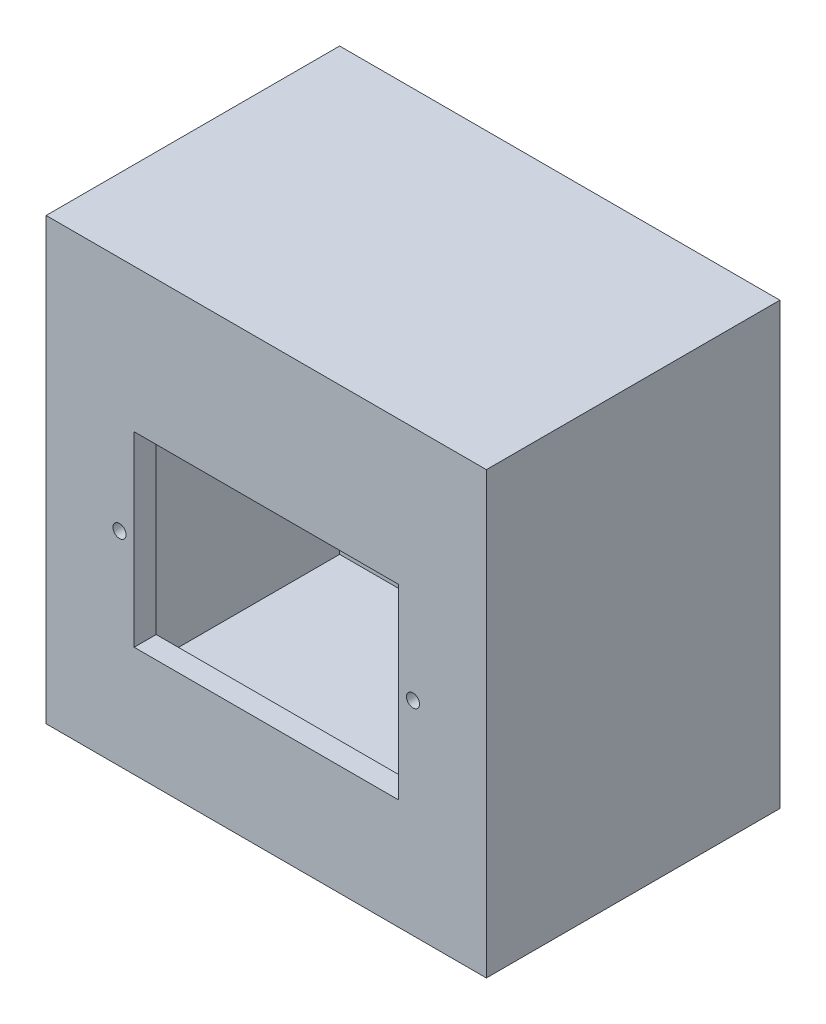
ISO-10303-21;
HEADER;
FILE_DESCRIPTION(('STEP AP214'),'2;1');
FILE_NAME('part.step','',(''),(''),'','','');
FILE_SCHEMA(('AUTOMOTIVE_DESIGN { 1 0 10303 214 1 1 1 1 }'));
ENDSEC;
DATA;
#1=APPLICATION_CONTEXT('core data for automotive mechanical design processes');
#2=APPLICATION_PROTOCOL_DEFINITION('international standard','automotive_design',2000,#1);
#3=PRODUCT_CONTEXT('',#1,'mechanical');
#4=PRODUCT('Part','Part','',(#3));
#5=PRODUCT_RELATED_PRODUCT_CATEGORY('part','',(#4));
#6=PRODUCT_DEFINITION_FORMATION('','',#4);
#7=PRODUCT_DEFINITION_CONTEXT('part definition',#1,'design');
#8=PRODUCT_DEFINITION('design','',#6,#7);
#9=PRODUCT_DEFINITION_SHAPE('','',#8);
#10=(LENGTH_UNIT() NAMED_UNIT(*) SI_UNIT(.MILLI.,.METRE.));
#11=(NAMED_UNIT(*) PLANE_ANGLE_UNIT() SI_UNIT($,.RADIAN.));
#12=(NAMED_UNIT(*) SI_UNIT($,.STERADIAN.) SOLID_ANGLE_UNIT());
#13=UNCERTAINTY_MEASURE_WITH_UNIT(LENGTH_MEASURE(1.E-05),#10,'distance_accuracy_value','');
#14=(GEOMETRIC_REPRESENTATION_CONTEXT(3) GLOBAL_UNCERTAINTY_ASSIGNED_CONTEXT((#13)) GLOBAL_UNIT_ASSIGNED_CONTEXT((#10,
#11,#12)) REPRESENTATION_CONTEXT('',''));
#15=CARTESIAN_POINT('',(0.,0.,0.));
#16=DIRECTION('',(0.,0.,1.));
#17=DIRECTION('',(1.,0.,0.));
#18=AXIS2_PLACEMENT_3D('',#15,#16,#17);
#19=CARTESIAN_POINT('',(-25.4,19.0956090691152,21.59));
#20=DIRECTION('',(-1.,0.,0.));
#21=DIRECTION('',(0.,-1.,0.));
#22=AXIS2_PLACEMENT_3D('',#19,#20,#21);
#23=PLANE('',#22);
#24=DIRECTION('',(0.,0.,1.));
#25=VECTOR('',#24,1.);
#26=CARTESIAN_POINT('',(-25.4,34.1197090691152,25.4));
#27=LINE('',#26,#25);
#28=CARTESIAN_POINT('',(-25.4,34.1197090691152,21.59));
#29=VERTEX_POINT('',#28);
#30=CARTESIAN_POINT('',(-25.4,34.1197090691152,22.86));
#31=VERTEX_POINT('',#30);
#32=EDGE_CURVE('E11',#29,#31,#27,.T.);
#33=ORIENTED_EDGE('',*,*,#32,.F.);
#34=DIRECTION('',(0.,-1.,0.));
#35=VECTOR('',#34,1.);
#36=CARTESIAN_POINT('',(-25.4,19.0956090691152,21.59));
#37=LINE('',#36,#35);
#38=CARTESIAN_POINT('',(-25.4,16.5556090691152,21.59));
#39=VERTEX_POINT('',#38);
#40=EDGE_CURVE('E185',#29,#39,#37,.T.);
#41=ORIENTED_EDGE('',*,*,#40,.T.);
#42=DIRECTION('',(0.,0.,1.));
#43=VECTOR('',#42,1.);
#44=CARTESIAN_POINT('',(-25.4,16.5556090691152,21.59));
#45=LINE('',#44,#43);
#46=CARTESIAN_POINT('',(-25.4,16.5556090691152,22.86));
#47=VERTEX_POINT('',#46);
#48=EDGE_CURVE('E306',#39,#47,#45,.T.);
#49=ORIENTED_EDGE('',*,*,#48,.T.);
#50=DIRECTION('',(0.,-1.,0.));
#51=VECTOR('',#50,1.);
#52=CARTESIAN_POINT('',(-25.4,19.0956090691152,22.86));
#53=LINE('',#52,#51);
#54=EDGE_CURVE('E293',#31,#47,#53,.T.);
#55=ORIENTED_EDGE('',*,*,#54,.F.);
#56=EDGE_LOOP('',(#33,#41,#49,#55));
#57=FACE_BOUND('',#56,.T.);
#58=ADVANCED_FACE('F33',(#57),#23,.T.);
#59=CARTESIAN_POINT('',(25.4,19.0956090691152,21.59));
#60=DIRECTION('',(1.,0.,0.));
#61=DIRECTION('',(0.,1.,0.));
#62=AXIS2_PLACEMENT_3D('',#59,#60,#61);
#63=PLANE('',#62);
#64=DIRECTION('',(0.,0.,1.));
#65=VECTOR('',#64,1.);
#66=CARTESIAN_POINT('',(25.4,36.3803090691153,25.4));
#67=LINE('',#66,#65);
#68=CARTESIAN_POINT('',(25.4,36.3803090691153,21.59));
#69=VERTEX_POINT('',#68);
#70=CARTESIAN_POINT('',(25.4,36.3803090691153,22.86));
#71=VERTEX_POINT('',#70);
#72=EDGE_CURVE('E175',#69,#71,#67,.T.);
#73=ORIENTED_EDGE('',*,*,#72,.F.);
#74=DIRECTION('',(0.,1.,0.));
#75=VECTOR('',#74,1.);
#76=CARTESIAN_POINT('',(25.4,19.0956090691152,21.59));
#77=LINE('',#76,#75);
#78=CARTESIAN_POINT('',(25.4,53.9444090691152,21.59));
#79=VERTEX_POINT('',#78);
#80=EDGE_CURVE('E290',#69,#79,#77,.T.);
#81=ORIENTED_EDGE('',*,*,#80,.T.);
#82=DIRECTION('',(0.,0.,1.));
#83=VECTOR('',#82,1.);
#84=CARTESIAN_POINT('',(25.4,53.9444090691152,21.59));
#85=LINE('',#84,#83);
#86=CARTESIAN_POINT('',(25.4,53.9444090691152,22.86));
#87=VERTEX_POINT('',#86);
#88=EDGE_CURVE('E193',#79,#87,#85,.T.);
#89=ORIENTED_EDGE('',*,*,#88,.T.);
#90=DIRECTION('',(0.,1.,0.));
#91=VECTOR('',#90,1.);
#92=CARTESIAN_POINT('',(25.4,19.0956090691152,22.86));
#93=LINE('',#92,#91);
#94=EDGE_CURVE('E273',#71,#87,#93,.T.);
#95=ORIENTED_EDGE('',*,*,#94,.F.);
#96=EDGE_LOOP('',(#73,#81,#89,#95));
#97=FACE_BOUND('',#96,.T.);
#98=ADVANCED_FACE('F279',(#97),#63,.T.);
#99=CARTESIAN_POINT('',(38.1,76.2,25.4));
#100=DIRECTION('',(-1.,0.,0.));
#101=DIRECTION('',(0.,0.,1.));
#102=AXIS2_PLACEMENT_3D('',#99,#100,#101);
#103=PLANE('',#102);
#104=DIRECTION('',(0.,0.,-1.));
#105=VECTOR('',#104,1.);
#106=CARTESIAN_POINT('',(38.1,0.,25.4));
#107=LINE('',#106,#105);
#108=CARTESIAN_POINT('',(38.1,0.,25.4));
#109=VERTEX_POINT('',#108);
#110=CARTESIAN_POINT('',(38.1,0.,-25.4));
#111=VERTEX_POINT('',#110);
#112=EDGE_CURVE('E222',#109,#111,#107,.T.);
#113=ORIENTED_EDGE('',*,*,#112,.T.);
#114=DIRECTION('',(0.,-1.,0.));
#115=VECTOR('',#114,1.);
#116=CARTESIAN_POINT('',(38.1,76.2,-25.4));
#117=LINE('',#116,#115);
#118=CARTESIAN_POINT('',(38.1,76.2,-25.4));
#119=VERTEX_POINT('',#118);
#120=EDGE_CURVE('E255',#119,#111,#117,.T.);
#121=ORIENTED_EDGE('',*,*,#120,.F.);
#122=DIRECTION('',(0.,0.,-1.));
#123=VECTOR('',#122,1.);
#124=CARTESIAN_POINT('',(38.1,76.2,25.4));
#125=LINE('',#124,#123);
#126=CARTESIAN_POINT('',(38.1,76.2,25.4));
#127=VERTEX_POINT('',#126);
#128=EDGE_CURVE('E229',#127,#119,#125,.T.);
#129=ORIENTED_EDGE('',*,*,#128,.F.);
#130=DIRECTION('',(0.,-1.,0.));
#131=VECTOR('',#130,1.);
#132=CARTESIAN_POINT('',(38.1,76.2,25.4));
#133=LINE('',#132,#131);
#134=EDGE_CURVE('E239',#127,#109,#133,.T.);
#135=ORIENTED_EDGE('',*,*,#134,.T.);
#136=EDGE_LOOP('',(#113,#121,#129,#135));
#137=FACE_BOUND('',#136,.T.);
#138=ADVANCED_FACE('F35',(#137),#103,.F.);
#139=CARTESIAN_POINT('',(-38.1,76.2,-25.4));
#140=DIRECTION('',(0.,0.,1.));
#141=DIRECTION('',(1.,0.,0.));
#142=AXIS2_PLACEMENT_3D('',#139,#140,#141);
#143=PLANE('',#142);
#144=CARTESIAN_POINT('',(-11.43,41.2535454474038,-25.4));
#145=DIRECTION('',(0.,0.,-1.));
#146=DIRECTION('',(0.,-1.,0.));
#147=AXIS2_PLACEMENT_3D('',#144,#145,#146);
#148=CIRCLE('',#147,2.794);
#149=CARTESIAN_POINT('',(-11.43,38.4595454474038,-25.4));
#150=VERTEX_POINT('',#149);
#151=EDGE_CURVE('E389',#150,#150,#148,.T.);
#152=ORIENTED_EDGE('',*,*,#151,.F.);
#153=EDGE_LOOP('',(#152));
#154=FACE_BOUND('',#153,.T.);
#155=CARTESIAN_POINT('',(-17.78,47.6035454474039,-25.4));
#156=DIRECTION('',(0.,0.,-1.));
#157=DIRECTION('',(1.,0.,0.));
#158=AXIS2_PLACEMENT_3D('',#155,#156,#157);
#159=CIRCLE('',#158,2.794);
#160=CARTESIAN_POINT('',(-14.986,47.6035454474039,-25.4));
#161=VERTEX_POINT('',#160);
#162=EDGE_CURVE('E393',#161,#161,#159,.T.);
#163=ORIENTED_EDGE('',*,*,#162,.F.);
#164=EDGE_LOOP('',(#163));
#165=FACE_BOUND('',#164,.T.);
#166=CARTESIAN_POINT('',(-24.13,41.2535454474039,-25.4));
#167=DIRECTION('',(0.,0.,-1.));
#168=DIRECTION('',(0.,1.,0.));
#169=AXIS2_PLACEMENT_3D('',#166,#167,#168);
#170=CIRCLE('',#169,2.794);
#171=CARTESIAN_POINT('',(-24.13,44.0475454474039,-25.4));
#172=VERTEX_POINT('',#171);
#173=EDGE_CURVE('E397',#172,#172,#170,.T.);
#174=ORIENTED_EDGE('',*,*,#173,.F.);
#175=EDGE_LOOP('',(#174));
#176=FACE_BOUND('',#175,.T.);
#177=CARTESIAN_POINT('',(-17.78,34.9035454474039,-25.4));
#178=DIRECTION('',(0.,0.,-1.));
#179=DIRECTION('',(-1.,0.,0.));
#180=AXIS2_PLACEMENT_3D('',#177,#178,#179);
#181=CIRCLE('',#180,2.794);
#182=CARTESIAN_POINT('',(-20.574,34.9035454474039,-25.4));
#183=VERTEX_POINT('',#182);
#184=EDGE_CURVE('E401',#183,#183,#181,.T.);
#185=ORIENTED_EDGE('',*,*,#184,.F.);
#186=EDGE_LOOP('',(#185));
#187=FACE_BOUND('',#186,.T.);
#188=CARTESIAN_POINT('',(24.13,41.2535454474038,-25.4));
#189=DIRECTION('',(0.,0.,-1.));
#190=DIRECTION('',(0.,-1.,0.));
#191=AXIS2_PLACEMENT_3D('',#188,#189,#190);
#192=CIRCLE('',#191,2.794);
#193=CARTESIAN_POINT('',(24.13,38.4595454474038,-25.4));
#194=VERTEX_POINT('',#193);
#195=EDGE_CURVE('E405',#194,#194,#192,.T.);
#196=ORIENTED_EDGE('',*,*,#195,.F.);
#197=EDGE_LOOP('',(#196));
#198=FACE_BOUND('',#197,.T.);
#199=CARTESIAN_POINT('',(17.78,47.6035454474039,-25.4));
#200=DIRECTION('',(0.,0.,-1.));
#201=DIRECTION('',(1.,0.,0.));
#202=AXIS2_PLACEMENT_3D('',#199,#200,#201);
#203=CIRCLE('',#202,2.794);
#204=CARTESIAN_POINT('',(20.574,47.6035454474039,-25.4));
#205=VERTEX_POINT('',#204);
#206=EDGE_CURVE('E409',#205,#205,#203,.T.);
#207=ORIENTED_EDGE('',*,*,#206,.F.);
#208=EDGE_LOOP('',(#207));
#209=FACE_BOUND('',#208,.T.);
#210=CARTESIAN_POINT('',(11.43,41.2535454474039,-25.4));
#211=DIRECTION('',(0.,0.,-1.));
#212=DIRECTION('',(0.,1.,0.));
#213=AXIS2_PLACEMENT_3D('',#210,#211,#212);
#214=CIRCLE('',#213,2.794);
#215=CARTESIAN_POINT('',(11.43,44.0475454474039,-25.4));
#216=VERTEX_POINT('',#215);
#217=EDGE_CURVE('E413',#216,#216,#214,.T.);
#218=ORIENTED_EDGE('',*,*,#217,.F.);
#219=EDGE_LOOP('',(#218));
#220=FACE_BOUND('',#219,.T.);
#221=CARTESIAN_POINT('',(17.78,34.9035454474039,-25.4));
#222=DIRECTION('',(0.,0.,-1.));
#223=DIRECTION('',(-1.,0.,0.));
#224=AXIS2_PLACEMENT_3D('',#221,#222,#223);
#225=CIRCLE('',#224,2.794);
#226=CARTESIAN_POINT('',(14.986,34.9035454474039,-25.4));
#227=VERTEX_POINT('',#226);
#228=EDGE_CURVE('E417',#227,#227,#225,.T.);
#229=ORIENTED_EDGE('',*,*,#228,.F.);
#230=EDGE_LOOP('',(#229));
#231=FACE_BOUND('',#230,.T.);
#232=DIRECTION('',(-1.,0.,0.));
#233=VECTOR('',#232,1.);
#234=CARTESIAN_POINT('',(-38.1,0.,-25.4));
#235=LINE('',#234,#233);
#236=CARTESIAN_POINT('',(-38.1,0.,-25.4));
#237=VERTEX_POINT('',#236);
#238=EDGE_CURVE('E242',#111,#237,#235,.T.);
#239=ORIENTED_EDGE('',*,*,#238,.T.);
#240=DIRECTION('',(0.,-1.,0.));
#241=VECTOR('',#240,1.);
#242=CARTESIAN_POINT('',(-38.1,76.2,-25.4));
#243=LINE('',#242,#241);
#244=CARTESIAN_POINT('',(-38.1,76.2,-25.4));
#245=VERTEX_POINT('',#244);
#246=EDGE_CURVE('E252',#245,#237,#243,.T.);
#247=ORIENTED_EDGE('',*,*,#246,.F.);
#248=DIRECTION('',(-1.,0.,0.));
#249=VECTOR('',#248,1.);
#250=CARTESIAN_POINT('',(-38.1,76.2,-25.4));
#251=LINE('',#250,#249);
#252=EDGE_CURVE('E232',#119,#245,#251,.T.);
#253=ORIENTED_EDGE('',*,*,#252,.F.);
#254=ORIENTED_EDGE('',*,*,#120,.T.);
#255=EDGE_LOOP('',(#239,#247,#253,#254));
#256=FACE_BOUND('',#255,.T.);
#257=ADVANCED_FACE('F378',(#154,#165,#176,#187,#198,#209,#220,#231,#256),#143,.F.);
#258=CARTESIAN_POINT('',(-38.1,76.2,25.4));
#259=DIRECTION('',(1.,0.,0.));
#260=DIRECTION('',(0.,0.,-1.));
#261=AXIS2_PLACEMENT_3D('',#258,#259,#260);
#262=PLANE('',#261);
#263=DIRECTION('',(0.,0.,1.));
#264=VECTOR('',#263,1.);
#265=CARTESIAN_POINT('',(-38.1,0.,25.4));
#266=LINE('',#265,#264);
#267=CARTESIAN_POINT('',(-38.1,0.,25.4));
#268=VERTEX_POINT('',#267);
#269=EDGE_CURVE('E244',#237,#268,#266,.T.);
#270=ORIENTED_EDGE('',*,*,#269,.T.);
#271=DIRECTION('',(0.,-1.,0.));
#272=VECTOR('',#271,1.);
#273=CARTESIAN_POINT('',(-38.1,76.2,25.4));
#274=LINE('',#273,#272);
#275=CARTESIAN_POINT('',(-38.1,76.2,25.4));
#276=VERTEX_POINT('',#275);
#277=EDGE_CURVE('E249',#276,#268,#274,.T.);
#278=ORIENTED_EDGE('',*,*,#277,.F.);
#279=DIRECTION('',(0.,0.,1.));
#280=VECTOR('',#279,1.);
#281=CARTESIAN_POINT('',(-38.1,76.2,25.4));
#282=LINE('',#281,#280);
#283=EDGE_CURVE('E235',#245,#276,#282,.T.);
#284=ORIENTED_EDGE('',*,*,#283,.F.);
#285=ORIENTED_EDGE('',*,*,#246,.T.);
#286=EDGE_LOOP('',(#270,#278,#284,#285));
#287=FACE_BOUND('',#286,.T.);
#288=ADVANCED_FACE('F375',(#287),#262,.F.);
#289=CARTESIAN_POINT('',(-38.1,76.2,25.4));
#290=DIRECTION('',(0.,0.,-1.));
#291=DIRECTION('',(-1.,0.,0.));
#292=AXIS2_PLACEMENT_3D('',#289,#290,#291);
#293=PLANE('',#292);
#294=CARTESIAN_POINT('',(-25.4,35.2500090691152,25.4));
#295=DIRECTION('',(0.,0.,1.));
#296=DIRECTION('',(1.,0.,0.));
#297=AXIS2_PLACEMENT_3D('',#294,#295,#296);
#298=CIRCLE('',#297,1.13029999999999);
#299=CARTESIAN_POINT('',(-24.2697,35.2500090691152,25.4));
#300=VERTEX_POINT('',#299);
#301=EDGE_CURVE('E430',#300,#300,#298,.T.);
#302=ORIENTED_EDGE('',*,*,#301,.F.);
#303=EDGE_LOOP('',(#302));
#304=FACE_BOUND('',#303,.T.);
#305=CARTESIAN_POINT('',(25.4,35.2500090691153,25.4));
#306=DIRECTION('',(0.,0.,1.));
#307=DIRECTION('',(1.,0.,0.));
#308=AXIS2_PLACEMENT_3D('',#305,#306,#307);
#309=CIRCLE('',#308,1.13029999999999);
#310=CARTESIAN_POINT('',(26.5303,35.2500090691153,25.4));
#311=VERTEX_POINT('',#310);
#312=EDGE_CURVE('E186',#311,#311,#309,.T.);
#313=ORIENTED_EDGE('',*,*,#312,.F.);
#314=EDGE_LOOP('',(#313));
#315=FACE_BOUND('',#314,.T.);
#316=DIRECTION('',(-1.,0.,0.));
#317=VECTOR('',#316,1.);
#318=CARTESIAN_POINT('',(-22.86,51.4044090691152,25.4));
#319=LINE('',#318,#317);
#320=CARTESIAN_POINT('',(22.86,51.4044090691152,25.4));
#321=VERTEX_POINT('',#320);
#322=CARTESIAN_POINT('',(-22.86,51.4044090691152,25.4));
#323=VERTEX_POINT('',#322);
#324=EDGE_CURVE('E211',#321,#323,#319,.T.);
#325=ORIENTED_EDGE('',*,*,#324,.F.);
#326=DIRECTION('',(0.,1.,0.));
#327=VECTOR('',#326,1.);
#328=CARTESIAN_POINT('',(22.86,19.0956090691152,25.4));
#329=LINE('',#328,#327);
#330=CARTESIAN_POINT('',(22.86,19.0956090691152,25.4));
#331=VERTEX_POINT('',#330);
#332=EDGE_CURVE('E209',#331,#321,#329,.T.);
#333=ORIENTED_EDGE('',*,*,#332,.F.);
#334=DIRECTION('',(1.,0.,0.));
#335=VECTOR('',#334,1.);
#336=CARTESIAN_POINT('',(-22.86,19.0956090691152,25.4));
#337=LINE('',#336,#335);
#338=CARTESIAN_POINT('',(-22.86,19.0956090691152,25.4));
#339=VERTEX_POINT('',#338);
#340=EDGE_CURVE('E202',#339,#331,#337,.T.);
#341=ORIENTED_EDGE('',*,*,#340,.F.);
#342=DIRECTION('',(0.,-1.,0.));
#343=VECTOR('',#342,1.);
#344=CARTESIAN_POINT('',(-22.86,19.0956090691152,25.4));
#345=LINE('',#344,#343);
#346=EDGE_CURVE('E215',#323,#339,#345,.T.);
#347=ORIENTED_EDGE('',*,*,#346,.F.);
#348=EDGE_LOOP('',(#325,#333,#341,#347));
#349=FACE_BOUND('',#348,.T.);
#350=DIRECTION('',(1.,0.,0.));
#351=VECTOR('',#350,1.);
#352=CARTESIAN_POINT('',(-38.1,0.,25.4));
#353=LINE('',#352,#351);
#354=EDGE_CURVE('E233',#268,#109,#353,.T.);
#355=ORIENTED_EDGE('',*,*,#354,.T.);
#356=ORIENTED_EDGE('',*,*,#134,.F.);
#357=DIRECTION('',(1.,0.,0.));
#358=VECTOR('',#357,1.);
#359=CARTESIAN_POINT('',(-38.1,76.2,25.4));
#360=LINE('',#359,#358);
#361=EDGE_CURVE('E237',#276,#127,#360,.T.);
#362=ORIENTED_EDGE('',*,*,#361,.F.);
#363=ORIENTED_EDGE('',*,*,#277,.T.);
#364=EDGE_LOOP('',(#355,#356,#362,#363));
#365=FACE_BOUND('',#364,.T.);
#366=ADVANCED_FACE('F368',(#304,#315,#349,#365),#293,.F.);
#367=CARTESIAN_POINT('',(0.,76.2,0.));
#368=DIRECTION('',(0.,-1.,0.));
#369=DIRECTION('',(0.,0.,-1.));
#370=AXIS2_PLACEMENT_3D('',#367,#368,#369);
#371=PLANE('',#370);
#372=ORIENTED_EDGE('',*,*,#128,.T.);
#373=ORIENTED_EDGE('',*,*,#252,.T.);
#374=ORIENTED_EDGE('',*,*,#283,.T.);
#375=ORIENTED_EDGE('',*,*,#361,.T.);
#376=EDGE_LOOP('',(#372,#373,#374,#375));
#377=FACE_BOUND('',#376,.T.);
#378=ADVANCED_FACE('F365',(#377),#371,.F.);
#379=CARTESIAN_POINT('',(0.,0.,0.));
#380=DIRECTION('',(0.,-1.,0.));
#381=DIRECTION('',(0.,0.,-1.));
#382=AXIS2_PLACEMENT_3D('',#379,#380,#381);
#383=PLANE('',#382);
#384=ORIENTED_EDGE('',*,*,#112,.F.);
#385=ORIENTED_EDGE('',*,*,#354,.F.);
#386=ORIENTED_EDGE('',*,*,#269,.F.);
#387=ORIENTED_EDGE('',*,*,#238,.F.);
#388=EDGE_LOOP('',(#384,#385,#386,#387));
#389=FACE_BOUND('',#388,.T.);
#390=ADVANCED_FACE('F363',(#389),#383,.T.);
#391=CARTESIAN_POINT('',(22.86,19.0956090691152,21.59));
#392=DIRECTION('',(1.,0.,0.));
#393=DIRECTION('',(0.,1.,0.));
#394=AXIS2_PLACEMENT_3D('',#391,#392,#393);
#395=PLANE('',#394);
#396=ORIENTED_EDGE('',*,*,#332,.T.);
#397=DIRECTION('',(0.,0.,1.));
#398=VECTOR('',#397,1.);
#399=CARTESIAN_POINT('',(22.86,51.4044090691152,21.59));
#400=LINE('',#399,#398);
#401=CARTESIAN_POINT('',(22.86,51.4044090691152,21.59));
#402=VERTEX_POINT('',#401);
#403=EDGE_CURVE('E208',#402,#321,#400,.T.);
#404=ORIENTED_EDGE('',*,*,#403,.F.);
#405=DIRECTION('',(0.,1.,0.));
#406=VECTOR('',#405,1.);
#407=CARTESIAN_POINT('',(22.86,19.0956090691152,21.59));
#408=LINE('',#407,#406);
#409=CARTESIAN_POINT('',(22.86,19.0956090691152,21.59));
#410=VERTEX_POINT('',#409);
#411=EDGE_CURVE('E199',#410,#402,#408,.T.);
#412=ORIENTED_EDGE('',*,*,#411,.F.);
#413=DIRECTION('',(0.,0.,1.));
#414=VECTOR('',#413,1.);
#415=CARTESIAN_POINT('',(22.86,19.0956090691152,21.59));
#416=LINE('',#415,#414);
#417=EDGE_CURVE('E220',#410,#331,#416,.T.);
#418=ORIENTED_EDGE('',*,*,#417,.T.);
#419=EDGE_LOOP('',(#396,#404,#412,#418));
#420=FACE_BOUND('',#419,.T.);
#421=ADVANCED_FACE('F352',(#420),#395,.F.);
#422=CARTESIAN_POINT('',(-22.86,19.0956090691152,21.59));
#423=DIRECTION('',(0.,-1.,0.));
#424=DIRECTION('',(0.,0.,-1.));
#425=AXIS2_PLACEMENT_3D('',#422,#423,#424);
#426=PLANE('',#425);
#427=ORIENTED_EDGE('',*,*,#340,.T.);
#428=ORIENTED_EDGE('',*,*,#417,.F.);
#429=DIRECTION('',(1.,0.,0.));
#430=VECTOR('',#429,1.);
#431=CARTESIAN_POINT('',(-22.86,19.0956090691152,21.59));
#432=LINE('',#431,#430);
#433=CARTESIAN_POINT('',(-22.86,19.0956090691152,21.59));
#434=VERTEX_POINT('',#433);
#435=EDGE_CURVE('E206',#434,#410,#432,.T.);
#436=ORIENTED_EDGE('',*,*,#435,.F.);
#437=DIRECTION('',(0.,0.,1.));
#438=VECTOR('',#437,1.);
#439=CARTESIAN_POINT('',(-22.86,19.0956090691152,21.59));
#440=LINE('',#439,#438);
#441=EDGE_CURVE('E223',#434,#339,#440,.T.);
#442=ORIENTED_EDGE('',*,*,#441,.T.);
#443=EDGE_LOOP('',(#427,#428,#436,#442));
#444=FACE_BOUND('',#443,.T.);
#445=ADVANCED_FACE('F348',(#444),#426,.F.);
#446=CARTESIAN_POINT('',(-22.86,19.0956090691152,21.59));
#447=DIRECTION('',(-1.,0.,0.));
#448=DIRECTION('',(0.,-1.,0.));
#449=AXIS2_PLACEMENT_3D('',#446,#447,#448);
#450=PLANE('',#449);
#451=ORIENTED_EDGE('',*,*,#346,.T.);
#452=ORIENTED_EDGE('',*,*,#441,.F.);
#453=DIRECTION('',(0.,-1.,0.));
#454=VECTOR('',#453,1.);
#455=CARTESIAN_POINT('',(-22.86,19.0956090691152,21.59));
#456=LINE('',#455,#454);
#457=CARTESIAN_POINT('',(-22.86,51.4044090691152,21.59));
#458=VERTEX_POINT('',#457);
#459=EDGE_CURVE('E204',#458,#434,#456,.T.);
#460=ORIENTED_EDGE('',*,*,#459,.F.);
#461=DIRECTION('',(0.,0.,1.));
#462=VECTOR('',#461,1.);
#463=CARTESIAN_POINT('',(-22.86,51.4044090691152,21.59));
#464=LINE('',#463,#462);
#465=EDGE_CURVE('E225',#458,#323,#464,.T.);
#466=ORIENTED_EDGE('',*,*,#465,.T.);
#467=EDGE_LOOP('',(#451,#452,#460,#466));
#468=FACE_BOUND('',#467,.T.);
#469=ADVANCED_FACE('F351',(#468),#450,.F.);
#470=CARTESIAN_POINT('',(-22.86,51.4044090691152,21.59));
#471=DIRECTION('',(0.,1.,0.));
#472=DIRECTION('',(0.,0.,1.));
#473=AXIS2_PLACEMENT_3D('',#470,#471,#472);
#474=PLANE('',#473);
#475=ORIENTED_EDGE('',*,*,#324,.T.);
#476=ORIENTED_EDGE('',*,*,#465,.F.);
#477=DIRECTION('',(-1.,0.,0.));
#478=VECTOR('',#477,1.);
#479=CARTESIAN_POINT('',(-22.86,51.4044090691152,21.59));
#480=LINE('',#479,#478);
#481=EDGE_CURVE('E201',#402,#458,#480,.T.);
#482=ORIENTED_EDGE('',*,*,#481,.F.);
#483=ORIENTED_EDGE('',*,*,#403,.T.);
#484=EDGE_LOOP('',(#475,#476,#482,#483));
#485=FACE_BOUND('',#484,.T.);
#486=ADVANCED_FACE('F356',(#485),#474,.F.);
#487=CARTESIAN_POINT('',(0.,0.,21.59));
#488=DIRECTION('',(0.,0.,-1.));
#489=DIRECTION('',(-1.,0.,0.));
#490=AXIS2_PLACEMENT_3D('',#487,#488,#489);
#491=PLANE('',#490);
#492=CARTESIAN_POINT('',(-25.4,35.2500090691152,21.59));
#493=DIRECTION('',(0.,0.,-1.));
#494=DIRECTION('',(-1.,0.,0.));
#495=AXIS2_PLACEMENT_3D('',#492,#493,#494);
#496=CIRCLE('',#495,1.13029999999999);
#497=CARTESIAN_POINT('',(-25.4,36.3803090691152,21.59));
#498=VERTEX_POINT('',#497);
#499=EDGE_CURVE('E169',#498,#29,#496,.T.);
#500=ORIENTED_EDGE('',*,*,#499,.F.);
#501=CARTESIAN_POINT('',(-25.4,53.9444090691152,21.59));
#502=VERTEX_POINT('',#501);
#503=EDGE_CURVE('E182',#502,#498,#37,.T.);
#504=ORIENTED_EDGE('',*,*,#503,.F.);
#505=DIRECTION('',(-1.,0.,0.));
#506=VECTOR('',#505,1.);
#507=CARTESIAN_POINT('',(-22.86,53.9444090691152,21.59));
#508=LINE('',#507,#506);
#509=EDGE_CURVE('E195',#79,#502,#508,.T.);
#510=ORIENTED_EDGE('',*,*,#509,.F.);
#511=ORIENTED_EDGE('',*,*,#80,.F.);
#512=CARTESIAN_POINT('',(25.4,35.2500090691153,21.59));
#513=DIRECTION('',(0.,0.,-1.));
#514=DIRECTION('',(-1.,0.,0.));
#515=AXIS2_PLACEMENT_3D('',#512,#513,#514);
#516=CIRCLE('',#515,1.13029999999999);
#517=CARTESIAN_POINT('',(25.4,34.1197090691153,21.59));
#518=VERTEX_POINT('',#517);
#519=EDGE_CURVE('E264',#518,#69,#516,.T.);
#520=ORIENTED_EDGE('',*,*,#519,.F.);
#521=CARTESIAN_POINT('',(25.4,16.5556090691152,21.59));
#522=VERTEX_POINT('',#521);
#523=EDGE_CURVE('E309',#522,#518,#77,.T.);
#524=ORIENTED_EDGE('',*,*,#523,.F.);
#525=DIRECTION('',(1.,0.,0.));
#526=VECTOR('',#525,1.);
#527=CARTESIAN_POINT('',(-22.86,16.5556090691152,21.59));
#528=LINE('',#527,#526);
#529=EDGE_CURVE('E190',#39,#522,#528,.T.);
#530=ORIENTED_EDGE('',*,*,#529,.F.);
#531=ORIENTED_EDGE('',*,*,#40,.F.);
#532=EDGE_LOOP('',(#500,#504,#510,#511,#520,#524,#530,#531));
#533=FACE_BOUND('',#532,.T.);
#534=ORIENTED_EDGE('',*,*,#411,.T.);
#535=ORIENTED_EDGE('',*,*,#481,.T.);
#536=ORIENTED_EDGE('',*,*,#459,.T.);
#537=ORIENTED_EDGE('',*,*,#435,.T.);
#538=EDGE_LOOP('',(#534,#535,#536,#537));
#539=FACE_BOUND('',#538,.T.);
#540=ADVANCED_FACE('F179',(#533,#539),#491,.T.);
#541=CARTESIAN_POINT('',(35.56,76.2,25.4));
#542=DIRECTION('',(-1.,0.,0.));
#543=DIRECTION('',(0.,0.,1.));
#544=AXIS2_PLACEMENT_3D('',#541,#542,#543);
#545=PLANE('',#544);
#546=DIRECTION('',(0.,0.,-1.));
#547=VECTOR('',#546,1.);
#548=CARTESIAN_POINT('',(35.56,2.54,0.));
#549=LINE('',#548,#547);
#550=CARTESIAN_POINT('',(35.56,2.54,22.86));
#551=VERTEX_POINT('',#550);
#552=CARTESIAN_POINT('',(35.56,2.54,-22.86));
#553=VERTEX_POINT('',#552);
#554=EDGE_CURVE('E305',#551,#553,#549,.T.);
#555=ORIENTED_EDGE('',*,*,#554,.F.);
#556=DIRECTION('',(0.,-1.,0.));
#557=VECTOR('',#556,1.);
#558=CARTESIAN_POINT('',(35.56,76.2,22.86));
#559=LINE('',#558,#557);
#560=CARTESIAN_POINT('',(35.56,73.66,22.86));
#561=VERTEX_POINT('',#560);
#562=EDGE_CURVE('E300',#561,#551,#559,.T.);
#563=ORIENTED_EDGE('',*,*,#562,.F.);
#564=DIRECTION('',(0.,0.,-1.));
#565=VECTOR('',#564,1.);
#566=CARTESIAN_POINT('',(35.56,73.66,0.));
#567=LINE('',#566,#565);
#568=CARTESIAN_POINT('',(35.56,73.66,-22.86));
#569=VERTEX_POINT('',#568);
#570=EDGE_CURVE('E296',#561,#569,#567,.T.);
#571=ORIENTED_EDGE('',*,*,#570,.T.);
#572=DIRECTION('',(0.,-1.,0.));
#573=VECTOR('',#572,1.);
#574=CARTESIAN_POINT('',(35.56,76.2,-22.86));
#575=LINE('',#574,#573);
#576=EDGE_CURVE('E212',#569,#553,#575,.T.);
#577=ORIENTED_EDGE('',*,*,#576,.T.);
#578=EDGE_LOOP('',(#555,#563,#571,#577));
#579=FACE_BOUND('',#578,.T.);
#580=ADVANCED_FACE('F476',(#579),#545,.T.);
#581=CARTESIAN_POINT('',(-38.1,76.2,-22.86));
#582=DIRECTION('',(0.,0.,1.));
#583=DIRECTION('',(1.,0.,0.));
#584=AXIS2_PLACEMENT_3D('',#581,#582,#583);
#585=PLANE('',#584);
#586=CARTESIAN_POINT('',(-11.43,41.2535454474038,-22.86));
#587=DIRECTION('',(0.,0.,1.));
#588=DIRECTION('',(1.,0.,0.));
#589=AXIS2_PLACEMENT_3D('',#586,#587,#588);
#590=CIRCLE('',#589,2.794);
#591=CARTESIAN_POINT('',(-8.63599999999999,41.2535454474038,-22.86));
#592=VERTEX_POINT('',#591);
#593=EDGE_CURVE('E663',#592,#592,#590,.F.);
#594=ORIENTED_EDGE('',*,*,#593,.T.);
#595=EDGE_LOOP('',(#594));
#596=FACE_BOUND('',#595,.T.);
#597=CARTESIAN_POINT('',(-17.78,47.6035454474039,-22.86));
#598=DIRECTION('',(0.,0.,1.));
#599=DIRECTION('',(1.,0.,0.));
#600=AXIS2_PLACEMENT_3D('',#597,#598,#599);
#601=CIRCLE('',#600,2.794);
#602=CARTESIAN_POINT('',(-14.986,47.6035454474039,-22.86));
#603=VERTEX_POINT('',#602);
#604=EDGE_CURVE('E664',#603,#603,#601,.F.);
#605=ORIENTED_EDGE('',*,*,#604,.T.);
#606=EDGE_LOOP('',(#605));
#607=FACE_BOUND('',#606,.T.);
#608=CARTESIAN_POINT('',(-24.13,41.2535454474039,-22.86));
#609=DIRECTION('',(0.,0.,1.));
#610=DIRECTION('',(1.,0.,0.));
#611=AXIS2_PLACEMENT_3D('',#608,#609,#610);
#612=CIRCLE('',#611,2.794);
#613=CARTESIAN_POINT('',(-21.336,41.2535454474039,-22.86));
#614=VERTEX_POINT('',#613);
#615=EDGE_CURVE('E670',#614,#614,#612,.F.);
#616=ORIENTED_EDGE('',*,*,#615,.T.);
#617=EDGE_LOOP('',(#616));
#618=FACE_BOUND('',#617,.T.);
#619=CARTESIAN_POINT('',(-17.78,34.9035454474039,-22.86));
#620=DIRECTION('',(0.,0.,1.));
#621=DIRECTION('',(1.,0.,0.));
#622=AXIS2_PLACEMENT_3D('',#619,#620,#621);
#623=CIRCLE('',#622,2.794);
#624=CARTESIAN_POINT('',(-14.986,34.9035454474039,-22.86));
#625=VERTEX_POINT('',#624);
#626=EDGE_CURVE('E675',#625,#625,#623,.F.);
#627=ORIENTED_EDGE('',*,*,#626,.T.);
#628=EDGE_LOOP('',(#627));
#629=FACE_BOUND('',#628,.T.);
#630=CARTESIAN_POINT('',(24.13,41.2535454474038,-22.86));
#631=DIRECTION('',(0.,0.,1.));
#632=DIRECTION('',(1.,0.,0.));
#633=AXIS2_PLACEMENT_3D('',#630,#631,#632);
#634=CIRCLE('',#633,2.794);
#635=CARTESIAN_POINT('',(26.924,41.2535454474038,-22.86));
#636=VERTEX_POINT('',#635);
#637=EDGE_CURVE('E677',#636,#636,#634,.F.);
#638=ORIENTED_EDGE('',*,*,#637,.T.);
#639=EDGE_LOOP('',(#638));
#640=FACE_BOUND('',#639,.T.);
#641=CARTESIAN_POINT('',(17.78,47.6035454474039,-22.86));
#642=DIRECTION('',(0.,0.,1.));
#643=DIRECTION('',(1.,0.,0.));
#644=AXIS2_PLACEMENT_3D('',#641,#642,#643);
#645=CIRCLE('',#644,2.794);
#646=CARTESIAN_POINT('',(20.574,47.6035454474039,-22.86));
#647=VERTEX_POINT('',#646);
#648=EDGE_CURVE('E683',#647,#647,#645,.F.);
#649=ORIENTED_EDGE('',*,*,#648,.T.);
#650=EDGE_LOOP('',(#649));
#651=FACE_BOUND('',#650,.T.);
#652=CARTESIAN_POINT('',(11.43,41.2535454474039,-22.86));
#653=DIRECTION('',(0.,0.,1.));
#654=DIRECTION('',(1.,0.,0.));
#655=AXIS2_PLACEMENT_3D('',#652,#653,#654);
#656=CIRCLE('',#655,2.794);
#657=CARTESIAN_POINT('',(14.224,41.2535454474039,-22.86));
#658=VERTEX_POINT('',#657);
#659=EDGE_CURVE('E438',#658,#658,#656,.F.);
#660=ORIENTED_EDGE('',*,*,#659,.T.);
#661=EDGE_LOOP('',(#660));
#662=FACE_BOUND('',#661,.T.);
#663=CARTESIAN_POINT('',(17.78,34.9035454474039,-22.86));
#664=DIRECTION('',(0.,0.,1.));
#665=DIRECTION('',(1.,0.,0.));
#666=AXIS2_PLACEMENT_3D('',#663,#664,#665);
#667=CIRCLE('',#666,2.794);
#668=CARTESIAN_POINT('',(20.574,34.9035454474039,-22.86));
#669=VERTEX_POINT('',#668);
#670=EDGE_CURVE('E431',#669,#669,#667,.F.);
#671=ORIENTED_EDGE('',*,*,#670,.T.);
#672=EDGE_LOOP('',(#671));
#673=FACE_BOUND('',#672,.T.);
#674=DIRECTION('',(-1.,0.,0.));
#675=VECTOR('',#674,1.);
#676=CARTESIAN_POINT('',(0.,2.54,-22.86));
#677=LINE('',#676,#675);
#678=CARTESIAN_POINT('',(-35.56,2.54,-22.86));
#679=VERTEX_POINT('',#678);
#680=EDGE_CURVE('E446',#553,#679,#677,.T.);
#681=ORIENTED_EDGE('',*,*,#680,.F.);
#682=ORIENTED_EDGE('',*,*,#576,.F.);
#683=DIRECTION('',(-1.,0.,0.));
#684=VECTOR('',#683,1.);
#685=CARTESIAN_POINT('',(0.,73.66,-22.86));
#686=LINE('',#685,#684);
#687=CARTESIAN_POINT('',(-35.56,73.66,-22.86));
#688=VERTEX_POINT('',#687);
#689=EDGE_CURVE('E452',#569,#688,#686,.T.);
#690=ORIENTED_EDGE('',*,*,#689,.T.);
#691=DIRECTION('',(0.,-1.,0.));
#692=VECTOR('',#691,1.);
#693=CARTESIAN_POINT('',(-35.56,76.2,-22.86));
#694=LINE('',#693,#692);
#695=EDGE_CURVE('E449',#688,#679,#694,.T.);
#696=ORIENTED_EDGE('',*,*,#695,.T.);
#697=EDGE_LOOP('',(#681,#682,#690,#696));
#698=FACE_BOUND('',#697,.T.);
#699=ADVANCED_FACE('F478',(#596,#607,#618,#629,#640,#651,#662,#673,#698),#585,.T.);
#700=CARTESIAN_POINT('',(-35.56,76.2,25.4));
#701=DIRECTION('',(1.,0.,0.));
#702=DIRECTION('',(0.,0.,-1.));
#703=AXIS2_PLACEMENT_3D('',#700,#701,#702);
#704=PLANE('',#703);
#705=DIRECTION('',(0.,0.,1.));
#706=VECTOR('',#705,1.);
#707=CARTESIAN_POINT('',(-35.56,2.54,0.));
#708=LINE('',#707,#706);
#709=CARTESIAN_POINT('',(-35.56,2.54,22.86));
#710=VERTEX_POINT('',#709);
#711=EDGE_CURVE('E297',#679,#710,#708,.T.);
#712=ORIENTED_EDGE('',*,*,#711,.F.);
#713=ORIENTED_EDGE('',*,*,#695,.F.);
#714=DIRECTION('',(0.,0.,1.));
#715=VECTOR('',#714,1.);
#716=CARTESIAN_POINT('',(-35.56,73.66,0.));
#717=LINE('',#716,#715);
#718=CARTESIAN_POINT('',(-35.56,73.66,22.86));
#719=VERTEX_POINT('',#718);
#720=EDGE_CURVE('E301',#688,#719,#717,.T.);
#721=ORIENTED_EDGE('',*,*,#720,.T.);
#722=DIRECTION('',(0.,-1.,0.));
#723=VECTOR('',#722,1.);
#724=CARTESIAN_POINT('',(-35.56,76.2,22.86));
#725=LINE('',#724,#723);
#726=EDGE_CURVE('E455',#719,#710,#725,.T.);
#727=ORIENTED_EDGE('',*,*,#726,.T.);
#728=EDGE_LOOP('',(#712,#713,#721,#727));
#729=FACE_BOUND('',#728,.T.);
#730=ADVANCED_FACE('F467',(#729),#704,.T.);
#731=CARTESIAN_POINT('',(-38.1,76.2,22.86));
#732=DIRECTION('',(0.,0.,-1.));
#733=DIRECTION('',(-1.,0.,0.));
#734=AXIS2_PLACEMENT_3D('',#731,#732,#733);
#735=PLANE('',#734);
#736=CARTESIAN_POINT('',(-25.4,35.2500090691152,22.86));
#737=DIRECTION('',(0.,0.,-1.));
#738=DIRECTION('',(-1.,0.,0.));
#739=AXIS2_PLACEMENT_3D('',#736,#737,#738);
#740=CIRCLE('',#739,1.13029999999999);
#741=CARTESIAN_POINT('',(-25.4,36.3803090691152,22.86));
#742=VERTEX_POINT('',#741);
#743=EDGE_CURVE('E47',#31,#742,#740,.T.);
#744=ORIENTED_EDGE('',*,*,#743,.F.);
#745=ORIENTED_EDGE('',*,*,#54,.T.);
#746=DIRECTION('',(1.,0.,0.));
#747=VECTOR('',#746,1.);
#748=CARTESIAN_POINT('',(-22.86,16.5556090691152,22.86));
#749=LINE('',#748,#747);
#750=CARTESIAN_POINT('',(25.4,16.5556090691152,22.86));
#751=VERTEX_POINT('',#750);
#752=EDGE_CURVE('E288',#47,#751,#749,.T.);
#753=ORIENTED_EDGE('',*,*,#752,.T.);
#754=CARTESIAN_POINT('',(25.4,34.1197090691153,22.86));
#755=VERTEX_POINT('',#754);
#756=EDGE_CURVE('E277',#751,#755,#93,.T.);
#757=ORIENTED_EDGE('',*,*,#756,.T.);
#758=CARTESIAN_POINT('',(25.4,35.2500090691153,22.86));
#759=DIRECTION('',(0.,0.,-1.));
#760=DIRECTION('',(-1.,0.,0.));
#761=AXIS2_PLACEMENT_3D('',#758,#759,#760);
#762=CIRCLE('',#761,1.13029999999999);
#763=EDGE_CURVE('E55',#71,#755,#762,.T.);
#764=ORIENTED_EDGE('',*,*,#763,.F.);
#765=ORIENTED_EDGE('',*,*,#94,.T.);
#766=DIRECTION('',(-1.,0.,0.));
#767=VECTOR('',#766,1.);
#768=CARTESIAN_POINT('',(-22.86,53.9444090691152,22.86));
#769=LINE('',#768,#767);
#770=CARTESIAN_POINT('',(-25.4,53.9444090691152,22.86));
#771=VERTEX_POINT('',#770);
#772=EDGE_CURVE('E283',#87,#771,#769,.T.);
#773=ORIENTED_EDGE('',*,*,#772,.T.);
#774=EDGE_CURVE('E291',#771,#742,#53,.T.);
#775=ORIENTED_EDGE('',*,*,#774,.T.);
#776=EDGE_LOOP('',(#744,#745,#753,#757,#764,#765,#773,#775));
#777=FACE_BOUND('',#776,.T.);
#778=DIRECTION('',(1.,0.,0.));
#779=VECTOR('',#778,1.);
#780=CARTESIAN_POINT('',(0.,2.54,22.86));
#781=LINE('',#780,#779);
#782=EDGE_CURVE('E294',#710,#551,#781,.T.);
#783=ORIENTED_EDGE('',*,*,#782,.F.);
#784=ORIENTED_EDGE('',*,*,#726,.F.);
#785=DIRECTION('',(1.,0.,0.));
#786=VECTOR('',#785,1.);
#787=CARTESIAN_POINT('',(0.,73.66,22.86));
#788=LINE('',#787,#786);
#789=EDGE_CURVE('E298',#719,#561,#788,.T.);
#790=ORIENTED_EDGE('',*,*,#789,.T.);
#791=ORIENTED_EDGE('',*,*,#562,.T.);
#792=EDGE_LOOP('',(#783,#784,#790,#791));
#793=FACE_BOUND('',#792,.T.);
#794=ADVANCED_FACE('F270',(#777,#793),#735,.T.);
#795=CARTESIAN_POINT('',(0.,73.66,0.));
#796=DIRECTION('',(0.,-1.,0.));
#797=DIRECTION('',(0.,0.,-1.));
#798=AXIS2_PLACEMENT_3D('',#795,#796,#797);
#799=PLANE('',#798);
#800=ORIENTED_EDGE('',*,*,#570,.F.);
#801=ORIENTED_EDGE('',*,*,#789,.F.);
#802=ORIENTED_EDGE('',*,*,#720,.F.);
#803=ORIENTED_EDGE('',*,*,#689,.F.);
#804=EDGE_LOOP('',(#800,#801,#802,#803));
#805=FACE_BOUND('',#804,.T.);
#806=ADVANCED_FACE('F330',(#805),#799,.T.);
#807=CARTESIAN_POINT('',(0.,2.54,0.));
#808=DIRECTION('',(0.,-1.,0.));
#809=DIRECTION('',(0.,0.,-1.));
#810=AXIS2_PLACEMENT_3D('',#807,#808,#809);
#811=PLANE('',#810);
#812=ORIENTED_EDGE('',*,*,#554,.T.);
#813=ORIENTED_EDGE('',*,*,#680,.T.);
#814=ORIENTED_EDGE('',*,*,#711,.T.);
#815=ORIENTED_EDGE('',*,*,#782,.T.);
#816=EDGE_LOOP('',(#812,#813,#814,#815));
#817=FACE_BOUND('',#816,.T.);
#818=ADVANCED_FACE('F323',(#817),#811,.F.);
#819=DIRECTION('',(0.,0.,1.));
#820=VECTOR('',#819,1.);
#821=CARTESIAN_POINT('',(25.4,34.1197090691153,25.4));
#822=LINE('',#821,#820);
#823=EDGE_CURVE('E258',#755,#518,#822,.F.);
#824=ORIENTED_EDGE('',*,*,#823,.F.);
#825=ORIENTED_EDGE('',*,*,#756,.F.);
#826=DIRECTION('',(0.,0.,1.));
#827=VECTOR('',#826,1.);
#828=CARTESIAN_POINT('',(25.4,16.5556090691152,21.59));
#829=LINE('',#828,#827);
#830=EDGE_CURVE('E303',#522,#751,#829,.T.);
#831=ORIENTED_EDGE('',*,*,#830,.F.);
#832=ORIENTED_EDGE('',*,*,#523,.T.);
#833=EDGE_LOOP('',(#824,#825,#831,#832));
#834=FACE_BOUND('',#833,.T.);
#835=ADVANCED_FACE('F321',(#834),#63,.T.);
#836=CARTESIAN_POINT('',(-22.86,16.5556090691152,21.59));
#837=DIRECTION('',(0.,-1.,0.));
#838=DIRECTION('',(0.,0.,-1.));
#839=AXIS2_PLACEMENT_3D('',#836,#837,#838);
#840=PLANE('',#839);
#841=ORIENTED_EDGE('',*,*,#752,.F.);
#842=ORIENTED_EDGE('',*,*,#48,.F.);
#843=ORIENTED_EDGE('',*,*,#529,.T.);
#844=ORIENTED_EDGE('',*,*,#830,.T.);
#845=EDGE_LOOP('',(#841,#842,#843,#844));
#846=FACE_BOUND('',#845,.T.);
#847=ADVANCED_FACE('F320',(#846),#840,.T.);
#848=DIRECTION('',(0.,0.,1.));
#849=VECTOR('',#848,1.);
#850=CARTESIAN_POINT('',(-25.4,36.3803090691152,25.4));
#851=LINE('',#850,#849);
#852=EDGE_CURVE('E41',#742,#498,#851,.F.);
#853=ORIENTED_EDGE('',*,*,#852,.F.);
#854=ORIENTED_EDGE('',*,*,#774,.F.);
#855=DIRECTION('',(0.,0.,1.));
#856=VECTOR('',#855,1.);
#857=CARTESIAN_POINT('',(-25.4,53.9444090691152,21.59));
#858=LINE('',#857,#856);
#859=EDGE_CURVE('E189',#502,#771,#858,.T.);
#860=ORIENTED_EDGE('',*,*,#859,.F.);
#861=ORIENTED_EDGE('',*,*,#503,.T.);
#862=EDGE_LOOP('',(#853,#854,#860,#861));
#863=FACE_BOUND('',#862,.T.);
#864=ADVANCED_FACE('F188',(#863),#23,.T.);
#865=CARTESIAN_POINT('',(-22.86,53.9444090691152,21.59));
#866=DIRECTION('',(0.,1.,0.));
#867=DIRECTION('',(0.,0.,1.));
#868=AXIS2_PLACEMENT_3D('',#865,#866,#867);
#869=PLANE('',#868);
#870=ORIENTED_EDGE('',*,*,#772,.F.);
#871=ORIENTED_EDGE('',*,*,#88,.F.);
#872=ORIENTED_EDGE('',*,*,#509,.T.);
#873=ORIENTED_EDGE('',*,*,#859,.T.);
#874=EDGE_LOOP('',(#870,#871,#872,#873));
#875=FACE_BOUND('',#874,.T.);
#876=ADVANCED_FACE('F314',(#875),#869,.T.);
#877=CARTESIAN_POINT('',(25.4,35.2500090691153,25.4));
#878=DIRECTION('',(0.,0.,1.));
#879=DIRECTION('',(1.,0.,0.));
#880=AXIS2_PLACEMENT_3D('',#877,#878,#879);
#881=CYLINDRICAL_SURFACE('',#880,1.13029999999999);
#882=ORIENTED_EDGE('',*,*,#519,.T.);
#883=ORIENTED_EDGE('',*,*,#72,.T.);
#884=ORIENTED_EDGE('',*,*,#763,.T.);
#885=ORIENTED_EDGE('',*,*,#823,.T.);
#886=EDGE_LOOP('',(#882,#883,#884,#885));
#887=FACE_BOUND('',#886,.T.);
#888=ORIENTED_EDGE('',*,*,#312,.T.);
#889=EDGE_LOOP('',(#888));
#890=FACE_BOUND('',#889,.T.);
#891=ADVANCED_FACE('F261',(#887,#890),#881,.F.);
#892=CARTESIAN_POINT('',(-25.4,35.2500090691152,25.4));
#893=DIRECTION('',(0.,0.,1.));
#894=DIRECTION('',(1.,0.,0.));
#895=AXIS2_PLACEMENT_3D('',#892,#893,#894);
#896=CYLINDRICAL_SURFACE('',#895,1.13029999999999);
#897=ORIENTED_EDGE('',*,*,#499,.T.);
#898=ORIENTED_EDGE('',*,*,#32,.T.);
#899=ORIENTED_EDGE('',*,*,#743,.T.);
#900=ORIENTED_EDGE('',*,*,#852,.T.);
#901=EDGE_LOOP('',(#897,#898,#899,#900));
#902=FACE_BOUND('',#901,.T.);
#903=ORIENTED_EDGE('',*,*,#301,.T.);
#904=EDGE_LOOP('',(#903));
#905=FACE_BOUND('',#904,.T.);
#906=ADVANCED_FACE('F167',(#902,#905),#896,.F.);
#907=CARTESIAN_POINT('',(17.78,34.9035454474039,25.401));
#908=DIRECTION('',(0.,0.,-1.));
#909=DIRECTION('',(-1.,0.,0.));
#910=AXIS2_PLACEMENT_3D('',#907,#908,#909);
#911=CYLINDRICAL_SURFACE('',#910,2.794);
#912=ORIENTED_EDGE('',*,*,#670,.F.);
#913=EDGE_LOOP('',(#912));
#914=FACE_BOUND('',#913,.T.);
#915=ORIENTED_EDGE('',*,*,#228,.T.);
#916=EDGE_LOOP('',(#915));
#917=FACE_BOUND('',#916,.T.);
#918=ADVANCED_FACE('F569',(#914,#917),#911,.F.);
#919=CARTESIAN_POINT('',(11.43,41.2535454474039,25.401));
#920=DIRECTION('',(0.,0.,-1.));
#921=DIRECTION('',(-1.,0.,0.));
#922=AXIS2_PLACEMENT_3D('',#919,#920,#921);
#923=CYLINDRICAL_SURFACE('',#922,2.794);
#924=ORIENTED_EDGE('',*,*,#659,.F.);
#925=EDGE_LOOP('',(#924));
#926=FACE_BOUND('',#925,.T.);
#927=ORIENTED_EDGE('',*,*,#217,.T.);
#928=EDGE_LOOP('',(#927));
#929=FACE_BOUND('',#928,.T.);
#930=ADVANCED_FACE('F578',(#926,#929),#923,.F.);
#931=CARTESIAN_POINT('',(17.78,47.6035454474039,25.401));
#932=DIRECTION('',(0.,0.,-1.));
#933=DIRECTION('',(-1.,0.,0.));
#934=AXIS2_PLACEMENT_3D('',#931,#932,#933);
#935=CYLINDRICAL_SURFACE('',#934,2.794);
#936=ORIENTED_EDGE('',*,*,#648,.F.);
#937=EDGE_LOOP('',(#936));
#938=FACE_BOUND('',#937,.T.);
#939=ORIENTED_EDGE('',*,*,#206,.T.);
#940=EDGE_LOOP('',(#939));
#941=FACE_BOUND('',#940,.T.);
#942=ADVANCED_FACE('F588',(#938,#941),#935,.F.);
#943=CARTESIAN_POINT('',(24.13,41.2535454474038,25.401));
#944=DIRECTION('',(0.,0.,-1.));
#945=DIRECTION('',(-1.,0.,0.));
#946=AXIS2_PLACEMENT_3D('',#943,#944,#945);
#947=CYLINDRICAL_SURFACE('',#946,2.794);
#948=ORIENTED_EDGE('',*,*,#637,.F.);
#949=EDGE_LOOP('',(#948));
#950=FACE_BOUND('',#949,.T.);
#951=ORIENTED_EDGE('',*,*,#195,.T.);
#952=EDGE_LOOP('',(#951));
#953=FACE_BOUND('',#952,.T.);
#954=ADVANCED_FACE('F598',(#950,#953),#947,.F.);
#955=CARTESIAN_POINT('',(-17.78,34.9035454474039,25.401));
#956=DIRECTION('',(0.,0.,-1.));
#957=DIRECTION('',(-1.,0.,0.));
#958=AXIS2_PLACEMENT_3D('',#955,#956,#957);
#959=CYLINDRICAL_SURFACE('',#958,2.794);
#960=ORIENTED_EDGE('',*,*,#626,.F.);
#961=EDGE_LOOP('',(#960));
#962=FACE_BOUND('',#961,.T.);
#963=ORIENTED_EDGE('',*,*,#184,.T.);
#964=EDGE_LOOP('',(#963));
#965=FACE_BOUND('',#964,.T.);
#966=ADVANCED_FACE('F608',(#962,#965),#959,.F.);
#967=CARTESIAN_POINT('',(-24.13,41.2535454474039,25.401));
#968=DIRECTION('',(0.,0.,-1.));
#969=DIRECTION('',(-1.,0.,0.));
#970=AXIS2_PLACEMENT_3D('',#967,#968,#969);
#971=CYLINDRICAL_SURFACE('',#970,2.794);
#972=ORIENTED_EDGE('',*,*,#615,.F.);
#973=EDGE_LOOP('',(#972));
#974=FACE_BOUND('',#973,.T.);
#975=ORIENTED_EDGE('',*,*,#173,.T.);
#976=EDGE_LOOP('',(#975));
#977=FACE_BOUND('',#976,.T.);
#978=ADVANCED_FACE('F617',(#974,#977),#971,.F.);
#979=CARTESIAN_POINT('',(-17.78,47.6035454474039,25.401));
#980=DIRECTION('',(0.,0.,-1.));
#981=DIRECTION('',(-1.,0.,0.));
#982=AXIS2_PLACEMENT_3D('',#979,#980,#981);
#983=CYLINDRICAL_SURFACE('',#982,2.794);
#984=ORIENTED_EDGE('',*,*,#604,.F.);
#985=EDGE_LOOP('',(#984));
#986=FACE_BOUND('',#985,.T.);
#987=ORIENTED_EDGE('',*,*,#162,.T.);
#988=EDGE_LOOP('',(#987));
#989=FACE_BOUND('',#988,.T.);
#990=ADVANCED_FACE('F637',(#986,#989),#983,.F.);
#991=CARTESIAN_POINT('',(-11.43,41.2535454474038,25.401));
#992=DIRECTION('',(0.,0.,-1.));
#993=DIRECTION('',(-1.,0.,0.));
#994=AXIS2_PLACEMENT_3D('',#991,#992,#993);
#995=CYLINDRICAL_SURFACE('',#994,2.794);
#996=ORIENTED_EDGE('',*,*,#593,.F.);
#997=EDGE_LOOP('',(#996));
#998=FACE_BOUND('',#997,.T.);
#999=ORIENTED_EDGE('',*,*,#151,.T.);
#1000=EDGE_LOOP('',(#999));
#1001=FACE_BOUND('',#1000,.T.);
#1002=ADVANCED_FACE('F647',(#998,#1001),#995,.F.);
#1003=CLOSED_SHELL('',(#58,#98,#138,#257,#288,#366,#378,#390,#421,#445,#469,#486,#540,#580,#699,
#730,#794,#806,#818,#835,#847,#864,#876,#891,#906,#918,#930,#942,#954,#966,#978,#990,#1002));
#1004=MANIFOLD_SOLID_BREP('B2',#1003);
#1005=ADVANCED_BREP_SHAPE_REPRESENTATION('',(#18,#1004),#14);
#1006=SHAPE_DEFINITION_REPRESENTATION(#9,#1005);
ENDSEC;
END-ISO-10303-21;
